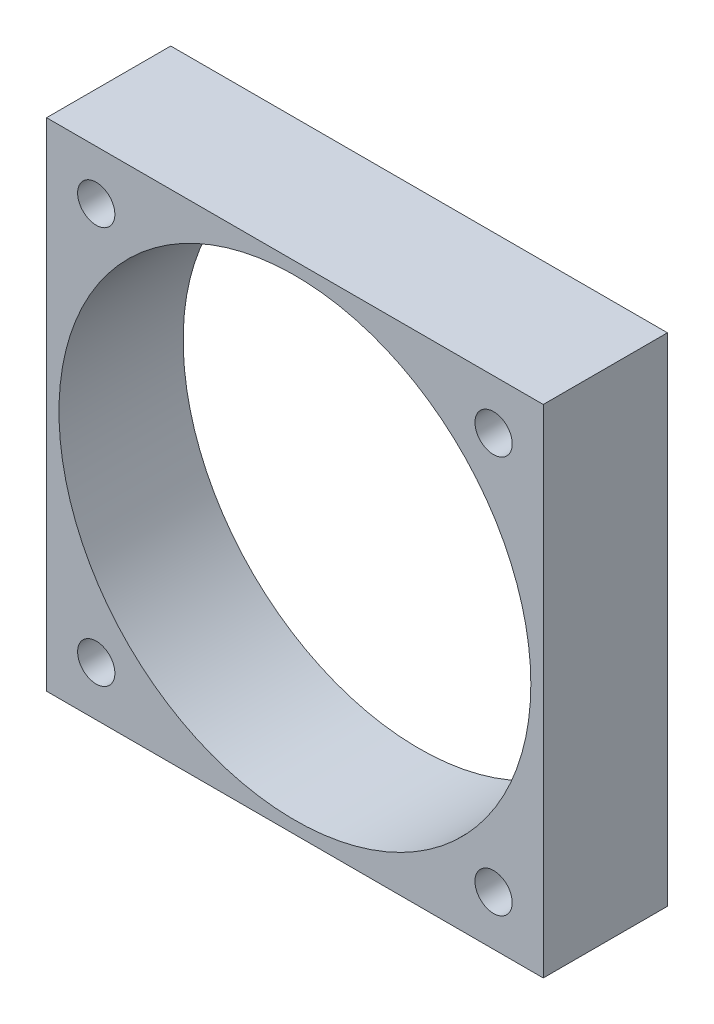
ISO-10303-21;
HEADER;
FILE_DESCRIPTION(('STEP AP214'),'2;1');
FILE_NAME('part.step','',(''),(''),'','','');
FILE_SCHEMA(('AUTOMOTIVE_DESIGN { 1 0 10303 214 1 1 1 1 }'));
ENDSEC;
DATA;
#1=APPLICATION_CONTEXT('core data for automotive mechanical design processes');
#2=APPLICATION_PROTOCOL_DEFINITION('international standard','automotive_design',2000,#1);
#3=PRODUCT_CONTEXT('',#1,'mechanical');
#4=PRODUCT('Part','Part','',(#3));
#5=PRODUCT_RELATED_PRODUCT_CATEGORY('part','',(#4));
#6=PRODUCT_DEFINITION_FORMATION('','',#4);
#7=PRODUCT_DEFINITION_CONTEXT('part definition',#1,'design');
#8=PRODUCT_DEFINITION('design','',#6,#7);
#9=PRODUCT_DEFINITION_SHAPE('','',#8);
#10=(LENGTH_UNIT() NAMED_UNIT(*) SI_UNIT(.MILLI.,.METRE.));
#11=(NAMED_UNIT(*) PLANE_ANGLE_UNIT() SI_UNIT($,.RADIAN.));
#12=(NAMED_UNIT(*) SI_UNIT($,.STERADIAN.) SOLID_ANGLE_UNIT());
#13=UNCERTAINTY_MEASURE_WITH_UNIT(LENGTH_MEASURE(1.E-05),#10,'distance_accuracy_value','');
#14=(GEOMETRIC_REPRESENTATION_CONTEXT(3) GLOBAL_UNCERTAINTY_ASSIGNED_CONTEXT((#13)) GLOBAL_UNIT_ASSIGNED_CONTEXT((#10,
#11,#12)) REPRESENTATION_CONTEXT('',''));
#15=CARTESIAN_POINT('',(0.,0.,0.));
#16=DIRECTION('',(0.,0.,1.));
#17=DIRECTION('',(1.,0.,0.));
#18=AXIS2_PLACEMENT_3D('',#15,#16,#17);
#19=CARTESIAN_POINT('',(-20.,20.,10.));
#20=DIRECTION('',(1.,0.,0.));
#21=DIRECTION('',(0.,1.,0.));
#22=AXIS2_PLACEMENT_3D('',#19,#20,#21);
#23=PLANE('',#22);
#24=DIRECTION('',(0.,-1.,0.));
#25=VECTOR('',#24,1.);
#26=CARTESIAN_POINT('',(-20.,20.,0.));
#27=LINE('',#26,#25);
#28=CARTESIAN_POINT('',(-20.,20.,0.));
#29=VERTEX_POINT('',#28);
#30=CARTESIAN_POINT('',(-20.,-20.,0.));
#31=VERTEX_POINT('',#30);
#32=EDGE_CURVE('E96',#29,#31,#27,.T.);
#33=ORIENTED_EDGE('',*,*,#32,.T.);
#34=DIRECTION('',(0.,0.,-1.));
#35=VECTOR('',#34,1.);
#36=CARTESIAN_POINT('',(-20.,-20.,10.));
#37=LINE('',#36,#35);
#38=CARTESIAN_POINT('',(-20.,-20.,10.));
#39=VERTEX_POINT('',#38);
#40=EDGE_CURVE('E11',#39,#31,#37,.T.);
#41=ORIENTED_EDGE('',*,*,#40,.F.);
#42=DIRECTION('',(0.,-1.,0.));
#43=VECTOR('',#42,1.);
#44=CARTESIAN_POINT('',(-20.,20.,10.));
#45=LINE('',#44,#43);
#46=CARTESIAN_POINT('',(-20.,20.,10.));
#47=VERTEX_POINT('',#46);
#48=EDGE_CURVE('E84',#47,#39,#45,.T.);
#49=ORIENTED_EDGE('',*,*,#48,.F.);
#50=DIRECTION('',(0.,0.,-1.));
#51=VECTOR('',#50,1.);
#52=CARTESIAN_POINT('',(-20.,20.,10.));
#53=LINE('',#52,#51);
#54=EDGE_CURVE('E92',#47,#29,#53,.T.);
#55=ORIENTED_EDGE('',*,*,#54,.T.);
#56=EDGE_LOOP('',(#33,#41,#49,#55));
#57=FACE_BOUND('',#56,.T.);
#58=ADVANCED_FACE('F33',(#57),#23,.F.);
#59=CARTESIAN_POINT('',(-20.,-20.,10.));
#60=DIRECTION('',(0.,1.,0.));
#61=DIRECTION('',(0.,0.,1.));
#62=AXIS2_PLACEMENT_3D('',#59,#60,#61);
#63=PLANE('',#62);
#64=DIRECTION('',(1.,0.,0.));
#65=VECTOR('',#64,1.);
#66=CARTESIAN_POINT('',(-20.,-20.,0.));
#67=LINE('',#66,#65);
#68=CARTESIAN_POINT('',(20.,-20.,0.));
#69=VERTEX_POINT('',#68);
#70=EDGE_CURVE('E88',#31,#69,#67,.T.);
#71=ORIENTED_EDGE('',*,*,#70,.T.);
#72=DIRECTION('',(0.,0.,-1.));
#73=VECTOR('',#72,1.);
#74=CARTESIAN_POINT('',(20.,-20.,10.));
#75=LINE('',#74,#73);
#76=CARTESIAN_POINT('',(20.,-20.,10.));
#77=VERTEX_POINT('',#76);
#78=EDGE_CURVE('E41',#77,#69,#75,.T.);
#79=ORIENTED_EDGE('',*,*,#78,.F.);
#80=DIRECTION('',(1.,0.,0.));
#81=VECTOR('',#80,1.);
#82=CARTESIAN_POINT('',(-20.,-20.,10.));
#83=LINE('',#82,#81);
#84=EDGE_CURVE('E79',#39,#77,#83,.T.);
#85=ORIENTED_EDGE('',*,*,#84,.F.);
#86=ORIENTED_EDGE('',*,*,#40,.T.);
#87=EDGE_LOOP('',(#71,#79,#85,#86));
#88=FACE_BOUND('',#87,.T.);
#89=ADVANCED_FACE('F87',(#88),#63,.F.);
#90=CARTESIAN_POINT('',(20.,20.,10.));
#91=DIRECTION('',(-1.,0.,0.));
#92=DIRECTION('',(0.,0.,1.));
#93=AXIS2_PLACEMENT_3D('',#90,#91,#92);
#94=PLANE('',#93);
#95=DIRECTION('',(0.,1.,0.));
#96=VECTOR('',#95,1.);
#97=CARTESIAN_POINT('',(20.,20.,0.));
#98=LINE('',#97,#96);
#99=CARTESIAN_POINT('',(20.,20.,0.));
#100=VERTEX_POINT('',#99);
#101=EDGE_CURVE('E66',#69,#100,#98,.T.);
#102=ORIENTED_EDGE('',*,*,#101,.T.);
#103=DIRECTION('',(0.,0.,-1.));
#104=VECTOR('',#103,1.);
#105=CARTESIAN_POINT('',(20.,20.,10.));
#106=LINE('',#105,#104);
#107=CARTESIAN_POINT('',(20.,20.,10.));
#108=VERTEX_POINT('',#107);
#109=EDGE_CURVE('E89',#108,#100,#106,.T.);
#110=ORIENTED_EDGE('',*,*,#109,.F.);
#111=DIRECTION('',(0.,1.,0.));
#112=VECTOR('',#111,1.);
#113=CARTESIAN_POINT('',(20.,20.,10.));
#114=LINE('',#113,#112);
#115=EDGE_CURVE('E82',#77,#108,#114,.T.);
#116=ORIENTED_EDGE('',*,*,#115,.F.);
#117=ORIENTED_EDGE('',*,*,#78,.T.);
#118=EDGE_LOOP('',(#102,#110,#116,#117));
#119=FACE_BOUND('',#118,.T.);
#120=ADVANCED_FACE('F90',(#119),#94,.F.);
#121=CARTESIAN_POINT('',(-20.,20.,10.));
#122=DIRECTION('',(0.,-1.,0.));
#123=DIRECTION('',(0.,0.,-1.));
#124=AXIS2_PLACEMENT_3D('',#121,#122,#123);
#125=PLANE('',#124);
#126=DIRECTION('',(-1.,0.,0.));
#127=VECTOR('',#126,1.);
#128=CARTESIAN_POINT('',(-20.,20.,0.));
#129=LINE('',#128,#127);
#130=EDGE_CURVE('E72',#100,#29,#129,.T.);
#131=ORIENTED_EDGE('',*,*,#130,.T.);
#132=ORIENTED_EDGE('',*,*,#54,.F.);
#133=DIRECTION('',(-1.,0.,0.));
#134=VECTOR('',#133,1.);
#135=CARTESIAN_POINT('',(-20.,20.,10.));
#136=LINE('',#135,#134);
#137=EDGE_CURVE('E49',#108,#47,#136,.T.);
#138=ORIENTED_EDGE('',*,*,#137,.F.);
#139=ORIENTED_EDGE('',*,*,#109,.T.);
#140=EDGE_LOOP('',(#131,#132,#138,#139));
#141=FACE_BOUND('',#140,.T.);
#142=ADVANCED_FACE('F104',(#141),#125,.F.);
#143=CARTESIAN_POINT('',(0.,0.,10.));
#144=DIRECTION('',(0.,0.,1.));
#145=DIRECTION('',(1.,0.,0.));
#146=AXIS2_PLACEMENT_3D('',#143,#144,#145);
#147=PLANE('',#146);
#148=CARTESIAN_POINT('',(-16.,-16.,10.));
#149=DIRECTION('',(0.,0.,1.));
#150=DIRECTION('',(1.,0.,0.));
#151=AXIS2_PLACEMENT_3D('',#148,#149,#150);
#152=CIRCLE('',#151,1.5);
#153=CARTESIAN_POINT('',(-14.5,-16.,10.));
#154=VERTEX_POINT('',#153);
#155=EDGE_CURVE('E134',#154,#154,#152,.T.);
#156=ORIENTED_EDGE('',*,*,#155,.F.);
#157=EDGE_LOOP('',(#156));
#158=FACE_BOUND('',#157,.T.);
#159=CARTESIAN_POINT('',(16.,-16.,10.));
#160=DIRECTION('',(0.,0.,1.));
#161=DIRECTION('',(1.,0.,0.));
#162=AXIS2_PLACEMENT_3D('',#159,#160,#161);
#163=CIRCLE('',#162,1.5);
#164=CARTESIAN_POINT('',(17.5,-16.,10.));
#165=VERTEX_POINT('',#164);
#166=EDGE_CURVE('E128',#165,#165,#163,.T.);
#167=ORIENTED_EDGE('',*,*,#166,.F.);
#168=EDGE_LOOP('',(#167));
#169=FACE_BOUND('',#168,.T.);
#170=CARTESIAN_POINT('',(16.,16.,10.));
#171=DIRECTION('',(0.,0.,1.));
#172=DIRECTION('',(1.,0.,0.));
#173=AXIS2_PLACEMENT_3D('',#170,#171,#172);
#174=CIRCLE('',#173,1.5);
#175=CARTESIAN_POINT('',(17.5,16.,10.));
#176=VERTEX_POINT('',#175);
#177=EDGE_CURVE('E122',#176,#176,#174,.T.);
#178=ORIENTED_EDGE('',*,*,#177,.F.);
#179=EDGE_LOOP('',(#178));
#180=FACE_BOUND('',#179,.T.);
#181=CARTESIAN_POINT('',(-16.,16.,10.));
#182=DIRECTION('',(0.,0.,1.));
#183=DIRECTION('',(1.,0.,0.));
#184=AXIS2_PLACEMENT_3D('',#181,#182,#183);
#185=CIRCLE('',#184,1.5);
#186=CARTESIAN_POINT('',(-14.5,16.,10.));
#187=VERTEX_POINT('',#186);
#188=EDGE_CURVE('E116',#187,#187,#185,.T.);
#189=ORIENTED_EDGE('',*,*,#188,.F.);
#190=EDGE_LOOP('',(#189));
#191=FACE_BOUND('',#190,.T.);
#192=CARTESIAN_POINT('',(0.,0.,10.));
#193=DIRECTION('',(0.,0.,1.));
#194=DIRECTION('',(1.,0.,0.));
#195=AXIS2_PLACEMENT_3D('',#192,#193,#194);
#196=CIRCLE('',#195,19.);
#197=CARTESIAN_POINT('',(19.,0.,10.));
#198=VERTEX_POINT('',#197);
#199=EDGE_CURVE('E110',#198,#198,#196,.T.);
#200=ORIENTED_EDGE('',*,*,#199,.F.);
#201=EDGE_LOOP('',(#200));
#202=FACE_BOUND('',#201,.T.);
#203=ORIENTED_EDGE('',*,*,#48,.T.);
#204=ORIENTED_EDGE('',*,*,#84,.T.);
#205=ORIENTED_EDGE('',*,*,#115,.T.);
#206=ORIENTED_EDGE('',*,*,#137,.T.);
#207=EDGE_LOOP('',(#203,#204,#205,#206));
#208=FACE_BOUND('',#207,.T.);
#209=ADVANCED_FACE('F80',(#158,#169,#180,#191,#202,#208),#147,.T.);
#210=CARTESIAN_POINT('',(0.,0.,0.));
#211=DIRECTION('',(0.,0.,1.));
#212=DIRECTION('',(1.,0.,0.));
#213=AXIS2_PLACEMENT_3D('',#210,#211,#212);
#214=PLANE('',#213);
#215=CARTESIAN_POINT('',(-16.,-16.,0.));
#216=DIRECTION('',(0.,0.,1.));
#217=DIRECTION('',(1.,0.,0.));
#218=AXIS2_PLACEMENT_3D('',#215,#216,#217);
#219=CIRCLE('',#218,1.5);
#220=CARTESIAN_POINT('',(-14.5,-16.,0.));
#221=VERTEX_POINT('',#220);
#222=EDGE_CURVE('E119',#221,#221,#219,.T.);
#223=ORIENTED_EDGE('',*,*,#222,.T.);
#224=EDGE_LOOP('',(#223));
#225=FACE_BOUND('',#224,.T.);
#226=CARTESIAN_POINT('',(16.,-16.,0.));
#227=DIRECTION('',(0.,0.,1.));
#228=DIRECTION('',(1.,0.,0.));
#229=AXIS2_PLACEMENT_3D('',#226,#227,#228);
#230=CIRCLE('',#229,1.5);
#231=CARTESIAN_POINT('',(17.5,-16.,0.));
#232=VERTEX_POINT('',#231);
#233=EDGE_CURVE('E131',#232,#232,#230,.T.);
#234=ORIENTED_EDGE('',*,*,#233,.T.);
#235=EDGE_LOOP('',(#234));
#236=FACE_BOUND('',#235,.T.);
#237=CARTESIAN_POINT('',(16.,16.,0.));
#238=DIRECTION('',(0.,0.,1.));
#239=DIRECTION('',(1.,0.,0.));
#240=AXIS2_PLACEMENT_3D('',#237,#238,#239);
#241=CIRCLE('',#240,1.5);
#242=CARTESIAN_POINT('',(17.5,16.,0.));
#243=VERTEX_POINT('',#242);
#244=EDGE_CURVE('E125',#243,#243,#241,.T.);
#245=ORIENTED_EDGE('',*,*,#244,.T.);
#246=EDGE_LOOP('',(#245));
#247=FACE_BOUND('',#246,.T.);
#248=CARTESIAN_POINT('',(-16.,16.,0.));
#249=DIRECTION('',(0.,0.,1.));
#250=DIRECTION('',(1.,0.,0.));
#251=AXIS2_PLACEMENT_3D('',#248,#249,#250);
#252=CIRCLE('',#251,1.5);
#253=CARTESIAN_POINT('',(-14.5,16.,0.));
#254=VERTEX_POINT('',#253);
#255=EDGE_CURVE('E113',#254,#254,#252,.T.);
#256=ORIENTED_EDGE('',*,*,#255,.T.);
#257=EDGE_LOOP('',(#256));
#258=FACE_BOUND('',#257,.T.);
#259=CARTESIAN_POINT('',(0.,0.,0.));
#260=DIRECTION('',(0.,0.,1.));
#261=DIRECTION('',(1.,0.,0.));
#262=AXIS2_PLACEMENT_3D('',#259,#260,#261);
#263=CIRCLE('',#262,19.);
#264=CARTESIAN_POINT('',(19.,0.,0.));
#265=VERTEX_POINT('',#264);
#266=EDGE_CURVE('E99',#265,#265,#263,.T.);
#267=ORIENTED_EDGE('',*,*,#266,.T.);
#268=EDGE_LOOP('',(#267));
#269=FACE_BOUND('',#268,.T.);
#270=ORIENTED_EDGE('',*,*,#32,.F.);
#271=ORIENTED_EDGE('',*,*,#130,.F.);
#272=ORIENTED_EDGE('',*,*,#101,.F.);
#273=ORIENTED_EDGE('',*,*,#70,.F.);
#274=EDGE_LOOP('',(#270,#271,#272,#273));
#275=FACE_BOUND('',#274,.T.);
#276=ADVANCED_FACE('F107',(#225,#236,#247,#258,#269,#275),#214,.F.);
#277=CARTESIAN_POINT('',(0.,0.,0.));
#278=DIRECTION('',(0.,0.,1.));
#279=DIRECTION('',(1.,0.,0.));
#280=AXIS2_PLACEMENT_3D('',#277,#278,#279);
#281=CYLINDRICAL_SURFACE('',#280,19.);
#282=ORIENTED_EDGE('',*,*,#266,.F.);
#283=EDGE_LOOP('',(#282));
#284=FACE_BOUND('',#283,.T.);
#285=ORIENTED_EDGE('',*,*,#199,.T.);
#286=EDGE_LOOP('',(#285));
#287=FACE_BOUND('',#286,.T.);
#288=ADVANCED_FACE('F160',(#284,#287),#281,.F.);
#289=CARTESIAN_POINT('',(-16.,16.,0.));
#290=DIRECTION('',(0.,0.,1.));
#291=DIRECTION('',(1.,0.,0.));
#292=AXIS2_PLACEMENT_3D('',#289,#290,#291);
#293=CYLINDRICAL_SURFACE('',#292,1.5);
#294=ORIENTED_EDGE('',*,*,#255,.F.);
#295=EDGE_LOOP('',(#294));
#296=FACE_BOUND('',#295,.T.);
#297=ORIENTED_EDGE('',*,*,#188,.T.);
#298=EDGE_LOOP('',(#297));
#299=FACE_BOUND('',#298,.T.);
#300=ADVANCED_FACE('F162',(#296,#299),#293,.F.);
#301=CARTESIAN_POINT('',(16.,16.,0.));
#302=DIRECTION('',(0.,0.,1.));
#303=DIRECTION('',(1.,0.,0.));
#304=AXIS2_PLACEMENT_3D('',#301,#302,#303);
#305=CYLINDRICAL_SURFACE('',#304,1.5);
#306=ORIENTED_EDGE('',*,*,#244,.F.);
#307=EDGE_LOOP('',(#306));
#308=FACE_BOUND('',#307,.T.);
#309=ORIENTED_EDGE('',*,*,#177,.T.);
#310=EDGE_LOOP('',(#309));
#311=FACE_BOUND('',#310,.T.);
#312=ADVANCED_FACE('F169',(#308,#311),#305,.F.);
#313=CARTESIAN_POINT('',(16.,-16.,0.));
#314=DIRECTION('',(0.,0.,1.));
#315=DIRECTION('',(1.,0.,0.));
#316=AXIS2_PLACEMENT_3D('',#313,#314,#315);
#317=CYLINDRICAL_SURFACE('',#316,1.5);
#318=ORIENTED_EDGE('',*,*,#233,.F.);
#319=EDGE_LOOP('',(#318));
#320=FACE_BOUND('',#319,.T.);
#321=ORIENTED_EDGE('',*,*,#166,.T.);
#322=EDGE_LOOP('',(#321));
#323=FACE_BOUND('',#322,.T.);
#324=ADVANCED_FACE('F145',(#320,#323),#317,.F.);
#325=CARTESIAN_POINT('',(-16.,-16.,0.));
#326=DIRECTION('',(0.,0.,1.));
#327=DIRECTION('',(1.,0.,0.));
#328=AXIS2_PLACEMENT_3D('',#325,#326,#327);
#329=CYLINDRICAL_SURFACE('',#328,1.5);
#330=ORIENTED_EDGE('',*,*,#222,.F.);
#331=EDGE_LOOP('',(#330));
#332=FACE_BOUND('',#331,.T.);
#333=ORIENTED_EDGE('',*,*,#155,.T.);
#334=EDGE_LOOP('',(#333));
#335=FACE_BOUND('',#334,.T.);
#336=ADVANCED_FACE('F142',(#332,#335),#329,.F.);
#337=CLOSED_SHELL('',(#58,#89,#120,#142,#209,#276,#288,#300,#312,#324,#336));
#338=MANIFOLD_SOLID_BREP('B2',#337);
#339=ADVANCED_BREP_SHAPE_REPRESENTATION('',(#18,#338),#14);
#340=SHAPE_DEFINITION_REPRESENTATION(#9,#339);
ENDSEC;
END-ISO-10303-21;
